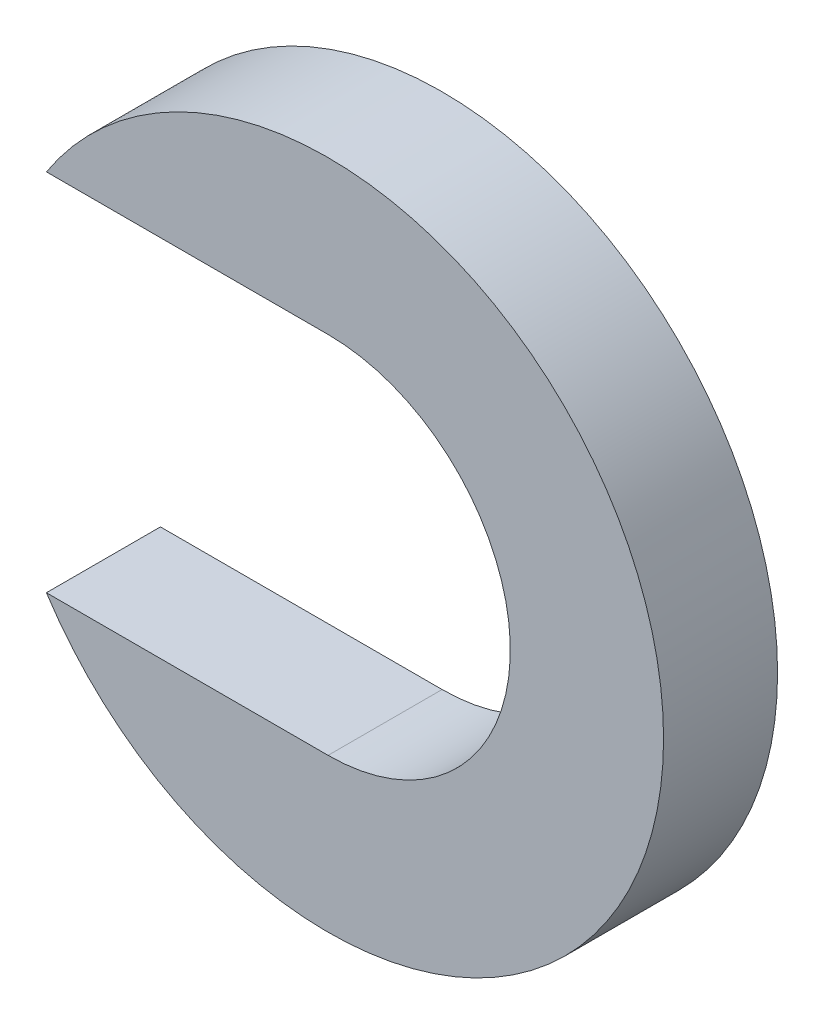
ISO-10303-21;
HEADER;
FILE_DESCRIPTION(('STEP AP214'),'2;1');
FILE_NAME('part.step','',(''),(''),'','','');
FILE_SCHEMA(('AUTOMOTIVE_DESIGN { 1 0 10303 214 1 1 1 1 }'));
ENDSEC;
DATA;
#1=APPLICATION_CONTEXT('core data for automotive mechanical design processes');
#2=APPLICATION_PROTOCOL_DEFINITION('international standard','automotive_design',2000,#1);
#3=PRODUCT_CONTEXT('',#1,'mechanical');
#4=PRODUCT('Part','Part','',(#3));
#5=PRODUCT_RELATED_PRODUCT_CATEGORY('part','',(#4));
#6=PRODUCT_DEFINITION_FORMATION('','',#4);
#7=PRODUCT_DEFINITION_CONTEXT('part definition',#1,'design');
#8=PRODUCT_DEFINITION('design','',#6,#7);
#9=PRODUCT_DEFINITION_SHAPE('','',#8);
#10=(LENGTH_UNIT() NAMED_UNIT(*) SI_UNIT(.MILLI.,.METRE.));
#11=(NAMED_UNIT(*) PLANE_ANGLE_UNIT() SI_UNIT($,.RADIAN.));
#12=(NAMED_UNIT(*) SI_UNIT($,.STERADIAN.) SOLID_ANGLE_UNIT());
#13=UNCERTAINTY_MEASURE_WITH_UNIT(LENGTH_MEASURE(1.E-05),#10,'distance_accuracy_value','');
#14=(GEOMETRIC_REPRESENTATION_CONTEXT(3) GLOBAL_UNCERTAINTY_ASSIGNED_CONTEXT((#13)) GLOBAL_UNIT_ASSIGNED_CONTEXT((#10,
#11,#12)) REPRESENTATION_CONTEXT('',''));
#15=CARTESIAN_POINT('',(0.,0.,0.));
#16=DIRECTION('',(0.,0.,1.));
#17=DIRECTION('',(1.,0.,0.));
#18=AXIS2_PLACEMENT_3D('',#15,#16,#17);
#19=CARTESIAN_POINT('',(0.,0.,3.0988));
#20=DIRECTION('',(0.,0.,-1.));
#21=DIRECTION('',(-1.,0.,0.));
#22=AXIS2_PLACEMENT_3D('',#19,#20,#21);
#23=CYLINDRICAL_SURFACE('',#22,4.953);
#24=CARTESIAN_POINT('',(0.,0.,0.));
#25=DIRECTION('',(0.,0.,-1.));
#26=DIRECTION('',(1.,0.,0.));
#27=AXIS2_PLACEMENT_3D('',#24,#25,#26);
#28=CIRCLE('',#27,4.953);
#29=CARTESIAN_POINT('',(0.,4.953,0.));
#30=VERTEX_POINT('',#29);
#31=CARTESIAN_POINT('',(0.,-4.953,0.));
#32=VERTEX_POINT('',#31);
#33=EDGE_CURVE('E113',#30,#32,#28,.T.);
#34=ORIENTED_EDGE('',*,*,#33,.T.);
#35=DIRECTION('',(0.,0.,-1.));
#36=VECTOR('',#35,1.);
#37=CARTESIAN_POINT('',(0.,-4.953,3.0988));
#38=LINE('',#37,#36);
#39=CARTESIAN_POINT('',(0.,-4.953,3.0988));
#40=VERTEX_POINT('',#39);
#41=EDGE_CURVE('E11',#40,#32,#38,.T.);
#42=ORIENTED_EDGE('',*,*,#41,.F.);
#43=CARTESIAN_POINT('',(0.,0.,3.0988));
#44=DIRECTION('',(0.,0.,-1.));
#45=DIRECTION('',(1.,0.,0.));
#46=AXIS2_PLACEMENT_3D('',#43,#44,#45);
#47=CIRCLE('',#46,4.953);
#48=CARTESIAN_POINT('',(0.,4.953,3.0988));
#49=VERTEX_POINT('',#48);
#50=EDGE_CURVE('E97',#49,#40,#47,.T.);
#51=ORIENTED_EDGE('',*,*,#50,.F.);
#52=DIRECTION('',(0.,0.,-1.));
#53=VECTOR('',#52,1.);
#54=CARTESIAN_POINT('',(0.,4.953,3.0988));
#55=LINE('',#54,#53);
#56=EDGE_CURVE('E109',#49,#30,#55,.T.);
#57=ORIENTED_EDGE('',*,*,#56,.T.);
#58=EDGE_LOOP('',(#34,#42,#51,#57));
#59=FACE_BOUND('',#58,.T.);
#60=ADVANCED_FACE('F45',(#59),#23,.F.);
#61=CARTESIAN_POINT('',(-7.65615157634696,-4.953,3.0988));
#62=DIRECTION('',(0.,-1.,0.));
#63=DIRECTION('',(0.,0.,-1.));
#64=AXIS2_PLACEMENT_3D('',#61,#62,#63);
#65=PLANE('',#64);
#66=DIRECTION('',(-1.,0.,0.));
#67=VECTOR('',#66,1.);
#68=CARTESIAN_POINT('',(-7.65615157634696,-4.953,0.));
#69=LINE('',#68,#67);
#70=CARTESIAN_POINT('',(-7.65615157634696,-4.953,0.));
#71=VERTEX_POINT('',#70);
#72=EDGE_CURVE('E102',#32,#71,#69,.T.);
#73=ORIENTED_EDGE('',*,*,#72,.T.);
#74=DIRECTION('',(0.,0.,-1.));
#75=VECTOR('',#74,1.);
#76=CARTESIAN_POINT('',(-7.65615157634696,-4.953,3.0988));
#77=LINE('',#76,#75);
#78=CARTESIAN_POINT('',(-7.65615157634696,-4.953,3.0988));
#79=VERTEX_POINT('',#78);
#80=EDGE_CURVE('E54',#79,#71,#77,.T.);
#81=ORIENTED_EDGE('',*,*,#80,.F.);
#82=DIRECTION('',(-1.,0.,0.));
#83=VECTOR('',#82,1.);
#84=CARTESIAN_POINT('',(-7.65615157634696,-4.953,3.0988));
#85=LINE('',#84,#83);
#86=EDGE_CURVE('E92',#40,#79,#85,.T.);
#87=ORIENTED_EDGE('',*,*,#86,.F.);
#88=ORIENTED_EDGE('',*,*,#41,.T.);
#89=EDGE_LOOP('',(#73,#81,#87,#88));
#90=FACE_BOUND('',#89,.T.);
#91=ADVANCED_FACE('F101',(#90),#65,.F.);
#92=CARTESIAN_POINT('',(0.,0.,3.0988));
#93=DIRECTION('',(0.,0.,-1.));
#94=DIRECTION('',(-1.,0.,0.));
#95=AXIS2_PLACEMENT_3D('',#92,#93,#94);
#96=CYLINDRICAL_SURFACE('',#95,9.1186);
#97=CARTESIAN_POINT('',(0.,0.,0.));
#98=DIRECTION('',(0.,0.,1.));
#99=DIRECTION('',(1.,0.,0.));
#100=AXIS2_PLACEMENT_3D('',#97,#98,#99);
#101=CIRCLE('',#100,9.1186);
#102=CARTESIAN_POINT('',(-7.65615157634696,4.953,0.));
#103=VERTEX_POINT('',#102);
#104=EDGE_CURVE('E79',#71,#103,#101,.T.);
#105=ORIENTED_EDGE('',*,*,#104,.T.);
#106=DIRECTION('',(0.,0.,-1.));
#107=VECTOR('',#106,1.);
#108=CARTESIAN_POINT('',(-7.65615157634696,4.953,3.0988));
#109=LINE('',#108,#107);
#110=CARTESIAN_POINT('',(-7.65615157634696,4.953,3.0988));
#111=VERTEX_POINT('',#110);
#112=EDGE_CURVE('E104',#111,#103,#109,.T.);
#113=ORIENTED_EDGE('',*,*,#112,.F.);
#114=CARTESIAN_POINT('',(0.,0.,3.0988));
#115=DIRECTION('',(0.,0.,1.));
#116=DIRECTION('',(1.,0.,0.));
#117=AXIS2_PLACEMENT_3D('',#114,#115,#116);
#118=CIRCLE('',#117,9.1186);
#119=EDGE_CURVE('E95',#79,#111,#118,.T.);
#120=ORIENTED_EDGE('',*,*,#119,.F.);
#121=ORIENTED_EDGE('',*,*,#80,.T.);
#122=EDGE_LOOP('',(#105,#113,#120,#121));
#123=FACE_BOUND('',#122,.T.);
#124=ADVANCED_FACE('F105',(#123),#96,.T.);
#125=CARTESIAN_POINT('',(0.,4.953,3.0988));
#126=DIRECTION('',(0.,1.,0.));
#127=DIRECTION('',(0.,0.,1.));
#128=AXIS2_PLACEMENT_3D('',#125,#126,#127);
#129=PLANE('',#128);
#130=DIRECTION('',(1.,0.,0.));
#131=VECTOR('',#130,1.);
#132=CARTESIAN_POINT('',(0.,4.953,0.));
#133=LINE('',#132,#131);
#134=EDGE_CURVE('E85',#103,#30,#133,.T.);
#135=ORIENTED_EDGE('',*,*,#134,.T.);
#136=ORIENTED_EDGE('',*,*,#56,.F.);
#137=DIRECTION('',(1.,0.,0.));
#138=VECTOR('',#137,1.);
#139=CARTESIAN_POINT('',(0.,4.953,3.0988));
#140=LINE('',#139,#138);
#141=EDGE_CURVE('E62',#111,#49,#140,.T.);
#142=ORIENTED_EDGE('',*,*,#141,.F.);
#143=ORIENTED_EDGE('',*,*,#112,.T.);
#144=EDGE_LOOP('',(#135,#136,#142,#143));
#145=FACE_BOUND('',#144,.T.);
#146=ADVANCED_FACE('F126',(#145),#129,.F.);
#147=CARTESIAN_POINT('',(0.,0.,3.0988));
#148=DIRECTION('',(0.,0.,1.));
#149=DIRECTION('',(1.,0.,0.));
#150=AXIS2_PLACEMENT_3D('',#147,#148,#149);
#151=PLANE('',#150);
#152=ORIENTED_EDGE('',*,*,#50,.T.);
#153=ORIENTED_EDGE('',*,*,#86,.T.);
#154=ORIENTED_EDGE('',*,*,#119,.T.);
#155=ORIENTED_EDGE('',*,*,#141,.T.);
#156=EDGE_LOOP('',(#152,#153,#154,#155));
#157=FACE_BOUND('',#156,.T.);
#158=ADVANCED_FACE('F93',(#157),#151,.T.);
#159=CARTESIAN_POINT('',(0.,0.,0.));
#160=DIRECTION('',(0.,0.,1.));
#161=DIRECTION('',(1.,0.,0.));
#162=AXIS2_PLACEMENT_3D('',#159,#160,#161);
#163=PLANE('',#162);
#164=ORIENTED_EDGE('',*,*,#33,.F.);
#165=ORIENTED_EDGE('',*,*,#134,.F.);
#166=ORIENTED_EDGE('',*,*,#104,.F.);
#167=ORIENTED_EDGE('',*,*,#72,.F.);
#168=EDGE_LOOP('',(#164,#165,#166,#167));
#169=FACE_BOUND('',#168,.T.);
#170=ADVANCED_FACE('F129',(#169),#163,.F.);
#171=CLOSED_SHELL('',(#60,#91,#124,#146,#158,#170));
#172=MANIFOLD_SOLID_BREP('B2',#171);
#173=ADVANCED_BREP_SHAPE_REPRESENTATION('',(#18,#172),#14);
#174=SHAPE_DEFINITION_REPRESENTATION(#9,#173);
ENDSEC;
END-ISO-10303-21;
